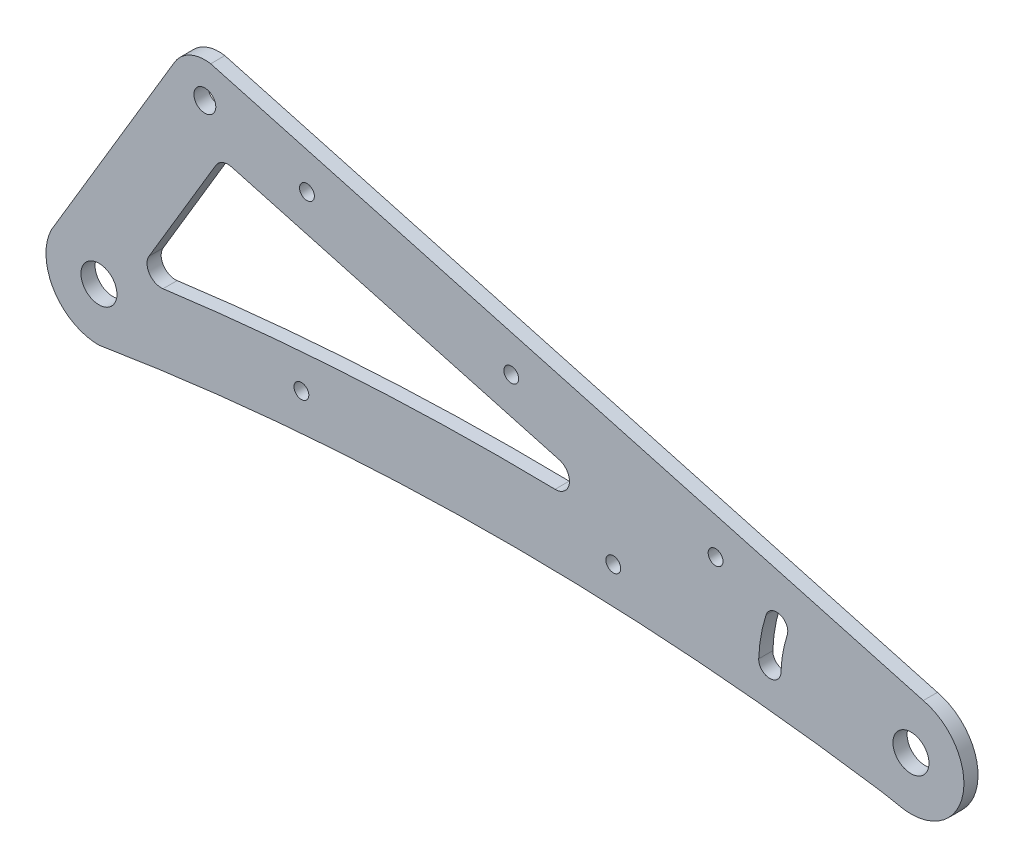
ISO-10303-21;
HEADER;
FILE_DESCRIPTION(('STEP AP214'),'2;1');
FILE_NAME('part.step','',(''),(''),'','','');
FILE_SCHEMA(('AUTOMOTIVE_DESIGN { 1 0 10303 214 1 1 1 1 }'));
ENDSEC;
DATA;
#1=APPLICATION_CONTEXT('core data for automotive mechanical design processes');
#2=APPLICATION_PROTOCOL_DEFINITION('international standard','automotive_design',2000,#1);
#3=PRODUCT_CONTEXT('',#1,'mechanical');
#4=PRODUCT('Part','Part','',(#3));
#5=PRODUCT_RELATED_PRODUCT_CATEGORY('part','',(#4));
#6=PRODUCT_DEFINITION_FORMATION('','',#4);
#7=PRODUCT_DEFINITION_CONTEXT('part definition',#1,'design');
#8=PRODUCT_DEFINITION('design','',#6,#7);
#9=PRODUCT_DEFINITION_SHAPE('','',#8);
#10=(LENGTH_UNIT() NAMED_UNIT(*) SI_UNIT(.MILLI.,.METRE.));
#11=(NAMED_UNIT(*) PLANE_ANGLE_UNIT() SI_UNIT($,.RADIAN.));
#12=(NAMED_UNIT(*) SI_UNIT($,.STERADIAN.) SOLID_ANGLE_UNIT());
#13=UNCERTAINTY_MEASURE_WITH_UNIT(LENGTH_MEASURE(1.E-05),#10,'distance_accuracy_value','');
#14=(GEOMETRIC_REPRESENTATION_CONTEXT(3) GLOBAL_UNCERTAINTY_ASSIGNED_CONTEXT((#13)) GLOBAL_UNIT_ASSIGNED_CONTEXT((#10,
#11,#12)) REPRESENTATION_CONTEXT('',''));
#15=CARTESIAN_POINT('',(0.,0.,0.));
#16=DIRECTION('',(0.,0.,1.));
#17=DIRECTION('',(1.,0.,0.));
#18=AXIS2_PLACEMENT_3D('',#15,#16,#17);
#19=CARTESIAN_POINT('',(204.633430014987,-118.311187667082,-4.));
#20=DIRECTION('',(0.,0.,1.));
#21=DIRECTION('',(1.,0.,0.));
#22=AXIS2_PLACEMENT_3D('',#19,#20,#21);
#23=CYLINDRICAL_SURFACE('',#22,106.);
#24=CARTESIAN_POINT('',(204.633430014987,-118.311187667082,0.));
#25=DIRECTION('',(0.,0.,-1.));
#26=DIRECTION('',(1.,0.,0.));
#27=AXIS2_PLACEMENT_3D('',#24,#25,#26);
#28=CIRCLE('',#27,106.);
#29=CARTESIAN_POINT('',(220.379871585658,-13.4872897341131,0.));
#30=VERTEX_POINT('',#29);
#31=CARTESIAN_POINT('',(226.855383886155,-14.6666761570763,0.));
#32=VERTEX_POINT('',#31);
#33=EDGE_CURVE('E292',#30,#32,#28,.T.);
#34=ORIENTED_EDGE('',*,*,#33,.F.);
#35=DIRECTION('',(0.,0.,1.));
#36=VECTOR('',#35,1.);
#37=CARTESIAN_POINT('',(220.379871585658,-13.4872897341131,-4.));
#38=LINE('',#37,#36);
#39=CARTESIAN_POINT('',(220.379871585658,-13.4872897341131,-4.));
#40=VERTEX_POINT('',#39);
#41=EDGE_CURVE('E11',#40,#30,#38,.T.);
#42=ORIENTED_EDGE('',*,*,#41,.F.);
#43=CARTESIAN_POINT('',(204.633430014987,-118.311187667082,-4.));
#44=DIRECTION('',(0.,0.,-1.));
#45=DIRECTION('',(1.,0.,0.));
#46=AXIS2_PLACEMENT_3D('',#43,#44,#45);
#47=CIRCLE('',#46,106.);
#48=CARTESIAN_POINT('',(226.855383886155,-14.6666761570763,-4.));
#49=VERTEX_POINT('',#48);
#50=EDGE_CURVE('E295',#40,#49,#47,.T.);
#51=ORIENTED_EDGE('',*,*,#50,.T.);
#52=DIRECTION('',(0.,0.,1.));
#53=VECTOR('',#52,1.);
#54=CARTESIAN_POINT('',(226.855383886155,-14.6666761570763,-4.));
#55=LINE('',#54,#53);
#56=EDGE_CURVE('E45',#49,#32,#55,.T.);
#57=ORIENTED_EDGE('',*,*,#56,.T.);
#58=EDGE_LOOP('',(#34,#42,#51,#57));
#59=FACE_BOUND('',#58,.T.);
#60=ADVANCED_FACE('F42',(#59),#23,.F.);
#61=CARTESIAN_POINT('',(115.,-715.,-4.));
#62=DIRECTION('',(0.,0.,1.));
#63=DIRECTION('',(1.,0.,0.));
#64=AXIS2_PLACEMENT_3D('',#61,#62,#63);
#65=CYLINDRICAL_SURFACE('',#64,709.383535190943);
#66=CARTESIAN_POINT('',(115.,-715.,0.));
#67=DIRECTION('',(0.,0.,-1.));
#68=DIRECTION('',(-1.,0.,0.));
#69=AXIS2_PLACEMENT_3D('',#66,#67,#68);
#70=CIRCLE('',#69,709.383535190943);
#71=CARTESIAN_POINT('',(0.,-15.,0.));
#72=VERTEX_POINT('',#71);
#73=EDGE_CURVE('E299',#72,#30,#70,.T.);
#74=ORIENTED_EDGE('',*,*,#73,.F.);
#75=DIRECTION('',(0.,0.,1.));
#76=VECTOR('',#75,1.);
#77=CARTESIAN_POINT('',(0.,-15.,-4.));
#78=LINE('',#77,#76);
#79=CARTESIAN_POINT('',(0.,-15.,-4.));
#80=VERTEX_POINT('',#79);
#81=EDGE_CURVE('E50',#80,#72,#78,.T.);
#82=ORIENTED_EDGE('',*,*,#81,.F.);
#83=CARTESIAN_POINT('',(115.,-715.,-4.));
#84=DIRECTION('',(0.,0.,-1.));
#85=DIRECTION('',(-1.,0.,0.));
#86=AXIS2_PLACEMENT_3D('',#83,#84,#85);
#87=CIRCLE('',#86,709.383535190943);
#88=EDGE_CURVE('E313',#80,#40,#87,.T.);
#89=ORIENTED_EDGE('',*,*,#88,.T.);
#90=ORIENTED_EDGE('',*,*,#41,.T.);
#91=EDGE_LOOP('',(#74,#82,#89,#90));
#92=FACE_BOUND('',#91,.T.);
#93=ADVANCED_FACE('F354',(#92),#65,.F.);
#94=CARTESIAN_POINT('',(0.,0.,-4.));
#95=DIRECTION('',(0.,0.,1.));
#96=DIRECTION('',(1.,0.,0.));
#97=AXIS2_PLACEMENT_3D('',#94,#95,#96);
#98=CYLINDRICAL_SURFACE('',#97,15.);
#99=CARTESIAN_POINT('',(0.,0.,0.));
#100=DIRECTION('',(0.,0.,1.));
#101=DIRECTION('',(1.,0.,0.));
#102=AXIS2_PLACEMENT_3D('',#99,#100,#101);
#103=CIRCLE('',#102,15.);
#104=CARTESIAN_POINT('',(-13.4841015537428,6.57107337414145,0.));
#105=VERTEX_POINT('',#104);
#106=EDGE_CURVE('E330',#105,#72,#103,.T.);
#107=ORIENTED_EDGE('',*,*,#106,.F.);
#108=DIRECTION('',(0.,0.,1.));
#109=VECTOR('',#108,1.);
#110=CARTESIAN_POINT('',(-13.4841015537428,6.57107337414145,-4.));
#111=LINE('',#110,#109);
#112=CARTESIAN_POINT('',(-13.4841015537428,6.57107337414145,-4.));
#113=VERTEX_POINT('',#112);
#114=EDGE_CURVE('E336',#113,#105,#111,.T.);
#115=ORIENTED_EDGE('',*,*,#114,.F.);
#116=CARTESIAN_POINT('',(0.,0.,-4.));
#117=DIRECTION('',(0.,0.,1.));
#118=DIRECTION('',(1.,0.,0.));
#119=AXIS2_PLACEMENT_3D('',#116,#117,#118);
#120=CIRCLE('',#119,15.);
#121=EDGE_CURVE('E310',#113,#80,#120,.T.);
#122=ORIENTED_EDGE('',*,*,#121,.T.);
#123=ORIENTED_EDGE('',*,*,#81,.T.);
#124=EDGE_LOOP('',(#107,#115,#122,#123));
#125=FACE_BOUND('',#124,.T.);
#126=ADVANCED_FACE('F372',(#125),#98,.T.);
#127=CARTESIAN_POINT('',(21.4162561466277,65.1302379535158,-4.));
#128=DIRECTION('',(-0.859010929428939,0.511957247357268,0.));
#129=DIRECTION('',(-0.511957247357268,-0.859010929428939,0.));
#130=AXIS2_PLACEMENT_3D('',#127,#128,#129);
#131=PLANE('',#130);
#132=DIRECTION('',(-0.511957247357268,-0.859010929428939,0.));
#133=VECTOR('',#132,1.);
#134=CARTESIAN_POINT('',(21.4162561466277,65.1302379535158,0.));
#135=LINE('',#134,#133);
#136=CARTESIAN_POINT('',(21.4162561466277,65.1302379535158,0.));
#137=VERTEX_POINT('',#136);
#138=EDGE_CURVE('E327',#137,#105,#135,.T.);
#139=ORIENTED_EDGE('',*,*,#138,.F.);
#140=DIRECTION('',(0.,0.,1.));
#141=VECTOR('',#140,1.);
#142=CARTESIAN_POINT('',(21.4162561466277,65.1302379535158,-4.));
#143=LINE('',#142,#141);
#144=CARTESIAN_POINT('',(21.4162561466277,65.1302379535158,-4.));
#145=VERTEX_POINT('',#144);
#146=EDGE_CURVE('E338',#145,#137,#143,.T.);
#147=ORIENTED_EDGE('',*,*,#146,.F.);
#148=DIRECTION('',(-0.511957247357268,-0.859010929428939,0.));
#149=VECTOR('',#148,1.);
#150=CARTESIAN_POINT('',(21.4162561466277,65.1302379535158,-4.));
#151=LINE('',#150,#149);
#152=EDGE_CURVE('E307',#145,#113,#151,.T.);
#153=ORIENTED_EDGE('',*,*,#152,.T.);
#154=ORIENTED_EDGE('',*,*,#114,.T.);
#155=EDGE_LOOP('',(#139,#147,#153,#154));
#156=FACE_BOUND('',#155,.T.);
#157=ADVANCED_FACE('F370',(#156),#131,.T.);
#158=CARTESIAN_POINT('',(30.,60.,-4.));
#159=DIRECTION('',(0.,0.,1.));
#160=DIRECTION('',(1.,0.,0.));
#161=AXIS2_PLACEMENT_3D('',#158,#159,#160);
#162=CYLINDRICAL_SURFACE('',#161,10.);
#163=CARTESIAN_POINT('',(30.,60.,0.));
#164=DIRECTION('',(0.,0.,1.));
#165=DIRECTION('',(1.,0.,0.));
#166=AXIS2_PLACEMENT_3D('',#163,#164,#165);
#167=CIRCLE('',#166,10.);
#168=CARTESIAN_POINT('',(31.6565828742478,69.8618321411769,0.));
#169=VERTEX_POINT('',#168);
#170=EDGE_CURVE('E324',#169,#137,#167,.T.);
#171=ORIENTED_EDGE('',*,*,#170,.F.);
#172=DIRECTION('',(0.,0.,1.));
#173=VECTOR('',#172,1.);
#174=CARTESIAN_POINT('',(31.6565828742478,69.8618321411769,-4.));
#175=LINE('',#174,#173);
#176=CARTESIAN_POINT('',(31.6565828742478,69.8618321411769,-4.));
#177=VERTEX_POINT('',#176);
#178=EDGE_CURVE('E340',#177,#169,#175,.T.);
#179=ORIENTED_EDGE('',*,*,#178,.F.);
#180=CARTESIAN_POINT('',(30.,60.,-4.));
#181=DIRECTION('',(0.,0.,1.));
#182=DIRECTION('',(1.,0.,0.));
#183=AXIS2_PLACEMENT_3D('',#180,#181,#182);
#184=CIRCLE('',#183,10.);
#185=EDGE_CURVE('E304',#177,#145,#184,.T.);
#186=ORIENTED_EDGE('',*,*,#185,.T.);
#187=ORIENTED_EDGE('',*,*,#146,.T.);
#188=EDGE_LOOP('',(#171,#179,#186,#187));
#189=FACE_BOUND('',#188,.T.);
#190=ADVANCED_FACE('F367',(#189),#162,.T.);
#191=CARTESIAN_POINT('',(31.6565828742478,69.8618321411769,-4.));
#192=DIRECTION('',(0.26413012047126,0.964487055102264,0.));
#193=DIRECTION('',(-0.964487055102264,0.26413012047126,0.));
#194=AXIS2_PLACEMENT_3D('',#191,#192,#193);
#195=PLANE('',#194);
#196=DIRECTION('',(-0.964487055102264,0.26413012047126,0.));
#197=VECTOR('',#196,1.);
#198=CARTESIAN_POINT('',(31.6565828742478,69.8618321411769,0.));
#199=LINE('',#198,#197);
#200=CARTESIAN_POINT('',(233.498309610251,14.5863576629269,0.));
#201=VERTEX_POINT('',#200);
#202=EDGE_CURVE('E321',#201,#169,#199,.T.);
#203=ORIENTED_EDGE('',*,*,#202,.F.);
#204=DIRECTION('',(0.,0.,1.));
#205=VECTOR('',#204,1.);
#206=CARTESIAN_POINT('',(233.498309610251,14.5863576629269,-4.));
#207=LINE('',#206,#205);
#208=CARTESIAN_POINT('',(233.498309610251,14.5863576629269,-4.));
#209=VERTEX_POINT('',#208);
#210=EDGE_CURVE('E341',#209,#201,#207,.T.);
#211=ORIENTED_EDGE('',*,*,#210,.F.);
#212=DIRECTION('',(-0.964487055102264,0.26413012047126,0.));
#213=VECTOR('',#212,1.);
#214=CARTESIAN_POINT('',(31.6565828742478,69.8618321411769,-4.));
#215=LINE('',#214,#213);
#216=EDGE_CURVE('E301',#209,#177,#215,.T.);
#217=ORIENTED_EDGE('',*,*,#216,.T.);
#218=ORIENTED_EDGE('',*,*,#178,.T.);
#219=EDGE_LOOP('',(#203,#211,#217,#218));
#220=FACE_BOUND('',#219,.T.);
#221=ADVANCED_FACE('F363',(#220),#195,.T.);
#222=CARTESIAN_POINT('',(230.,0.,-4.));
#223=DIRECTION('',(0.,0.,1.));
#224=DIRECTION('',(1.,0.,0.));
#225=AXIS2_PLACEMENT_3D('',#222,#223,#224);
#226=CYLINDRICAL_SURFACE('',#225,15.);
#227=CARTESIAN_POINT('',(230.,0.,0.));
#228=DIRECTION('',(0.,0.,1.));
#229=DIRECTION('',(1.,0.,0.));
#230=AXIS2_PLACEMENT_3D('',#227,#228,#229);
#231=CIRCLE('',#230,15.);
#232=EDGE_CURVE('E318',#32,#201,#231,.T.);
#233=ORIENTED_EDGE('',*,*,#232,.F.);
#234=ORIENTED_EDGE('',*,*,#56,.F.);
#235=CARTESIAN_POINT('',(230.,0.,-4.));
#236=DIRECTION('',(0.,0.,1.));
#237=DIRECTION('',(-1.,0.,0.));
#238=AXIS2_PLACEMENT_3D('',#235,#236,#237);
#239=CIRCLE('',#238,15.);
#240=EDGE_CURVE('E298',#49,#209,#239,.T.);
#241=ORIENTED_EDGE('',*,*,#240,.T.);
#242=ORIENTED_EDGE('',*,*,#210,.T.);
#243=EDGE_LOOP('',(#233,#234,#241,#242));
#244=FACE_BOUND('',#243,.T.);
#245=ADVANCED_FACE('F361',(#244),#226,.T.);
#246=CARTESIAN_POINT('',(204.633430014987,-118.311187667082,-4.));
#247=DIRECTION('',(0.,0.,1.));
#248=DIRECTION('',(1.,0.,0.));
#249=AXIS2_PLACEMENT_3D('',#246,#247,#248);
#250=PLANE('',#249);
#251=CARTESIAN_POINT('',(190.024366919236,1.39597986809987,-4.));
#252=DIRECTION('',(0.,0.,1.));
#253=DIRECTION('',(1.,0.,0.));
#254=AXIS2_PLACEMENT_3D('',#251,#252,#253);
#255=CIRCLE('',#254,3.15);
#256=CARTESIAN_POINT('',(186.876285814126,1.50591328271273,-4.));
#257=VERTEX_POINT('',#256);
#258=CARTESIAN_POINT('',(193.172448024346,1.286046453487,-4.));
#259=VERTEX_POINT('',#258);
#260=EDGE_CURVE('E192',#257,#259,#255,.T.);
#261=ORIENTED_EDGE('',*,*,#260,.T.);
#262=CARTESIAN_POINT('',(230.,0.,-4.));
#263=DIRECTION('',(0.,0.,1.));
#264=DIRECTION('',(1.,0.,0.));
#265=AXIS2_PLACEMENT_3D('',#262,#263,#264);
#266=CIRCLE('',#265,36.85);
#267=CARTESIAN_POINT('',(194.953567374524,11.387276242717,-4.));
#268=VERTEX_POINT('',#267);
#269=EDGE_CURVE('E195',#259,#268,#266,.F.);
#270=ORIENTED_EDGE('',*,*,#269,.T.);
#271=CARTESIAN_POINT('',(191.957739348194,12.3606797749981,-4.));
#272=DIRECTION('',(0.,0.,1.));
#273=DIRECTION('',(1.,0.,0.));
#274=AXIS2_PLACEMENT_3D('',#271,#272,#273);
#275=CIRCLE('',#274,3.14999999999999);
#276=CARTESIAN_POINT('',(188.961911321864,13.3340833072791,-4.));
#277=VERTEX_POINT('',#276);
#278=EDGE_CURVE('E187',#268,#277,#275,.T.);
#279=ORIENTED_EDGE('',*,*,#278,.T.);
#280=CARTESIAN_POINT('',(230.,0.,-4.));
#281=DIRECTION('',(0.,0.,1.));
#282=DIRECTION('',(1.,0.,0.));
#283=AXIS2_PLACEMENT_3D('',#280,#281,#282);
#284=CIRCLE('',#283,43.15);
#285=EDGE_CURVE('E167',#277,#257,#284,.T.);
#286=ORIENTED_EDGE('',*,*,#285,.T.);
#287=EDGE_LOOP('',(#261,#270,#279,#286));
#288=FACE_BOUND('',#287,.T.);
#289=CARTESIAN_POINT('',(58.9211424929098,52.0270760128541,-4.));
#290=DIRECTION('',(0.,0.,1.));
#291=DIRECTION('',(1.,0.,0.));
#292=AXIS2_PLACEMENT_3D('',#289,#290,#291);
#293=CIRCLE('',#292,2.09999999999999);
#294=CARTESIAN_POINT('',(61.0211424929098,52.0270760128541,-4.));
#295=VERTEX_POINT('',#294);
#296=EDGE_CURVE('E225',#295,#295,#293,.T.);
#297=ORIENTED_EDGE('',*,*,#296,.T.);
#298=EDGE_LOOP('',(#297));
#299=FACE_BOUND('',#298,.T.);
#300=CARTESIAN_POINT('',(116.790365799046,36.1792687845785,-4.));
#301=DIRECTION('',(0.,0.,1.));
#302=DIRECTION('',(1.,0.,0.));
#303=AXIS2_PLACEMENT_3D('',#300,#301,#302);
#304=CIRCLE('',#303,2.09999999999999);
#305=CARTESIAN_POINT('',(118.890365799046,36.1792687845785,-4.));
#306=VERTEX_POINT('',#305);
#307=EDGE_CURVE('E222',#306,#306,#304,.T.);
#308=ORIENTED_EDGE('',*,*,#307,.T.);
#309=EDGE_LOOP('',(#308));
#310=FACE_BOUND('',#309,.T.);
#311=CARTESIAN_POINT('',(145.694686329833,4.1011676287479,-4.));
#312=DIRECTION('',(0.,0.,1.));
#313=DIRECTION('',(1.,0.,0.));
#314=AXIS2_PLACEMENT_3D('',#311,#312,#313);
#315=CIRCLE('',#314,2.09999999999999);
#316=CARTESIAN_POINT('',(147.794686329833,4.1011676287479,-4.));
#317=VERTEX_POINT('',#316);
#318=EDGE_CURVE('E219',#317,#317,#315,.T.);
#319=ORIENTED_EDGE('',*,*,#318,.T.);
#320=EDGE_LOOP('',(#319));
#321=FACE_BOUND('',#320,.T.);
#322=CARTESIAN_POINT('',(174.659589105182,20.3314615563029,-4.));
#323=DIRECTION('',(0.,0.,1.));
#324=DIRECTION('',(1.,0.,0.));
#325=AXIS2_PLACEMENT_3D('',#322,#323,#324);
#326=CIRCLE('',#325,2.09999999999999);
#327=CARTESIAN_POINT('',(176.759589105182,20.3314615563029,-4.));
#328=VERTEX_POINT('',#327);
#329=EDGE_CURVE('E216',#328,#328,#326,.T.);
#330=ORIENTED_EDGE('',*,*,#329,.T.);
#331=EDGE_LOOP('',(#330));
#332=FACE_BOUND('',#331,.T.);
#333=CARTESIAN_POINT('',(57.3419719734467,2.44282340685842,-4.));
#334=DIRECTION('',(0.,0.,1.));
#335=DIRECTION('',(1.,0.,0.));
#336=AXIS2_PLACEMENT_3D('',#333,#334,#335);
#337=CIRCLE('',#336,2.09999999999999);
#338=CARTESIAN_POINT('',(59.4419719734467,2.44282340685842,-4.));
#339=VERTEX_POINT('',#338);
#340=EDGE_CURVE('E213',#339,#339,#337,.T.);
#341=ORIENTED_EDGE('',*,*,#340,.T.);
#342=EDGE_LOOP('',(#341));
#343=FACE_BOUND('',#342,.T.);
#344=CARTESIAN_POINT('',(115.,-715.,-4.));
#345=DIRECTION('',(0.,0.,-1.));
#346=DIRECTION('',(-1.,0.,0.));
#347=AXIS2_PLACEMENT_3D('',#344,#345,#346);
#348=CIRCLE('',#347,729.383535190943);
#349=CARTESIAN_POINT('',(18.156304086855,7.9257499698846,-4.));
#350=VERTEX_POINT('',#349);
#351=CARTESIAN_POINT('',(129.197928500749,14.2453361070782,-4.));
#352=VERTEX_POINT('',#351);
#353=EDGE_CURVE('E245',#350,#352,#348,.T.);
#354=ORIENTED_EDGE('',*,*,#353,.T.);
#355=CARTESIAN_POINT('',(129.275791122077,18.2445782118024,-4.));
#356=DIRECTION('',(0.,0.,1.));
#357=DIRECTION('',(1.,0.,0.));
#358=AXIS2_PLACEMENT_3D('',#355,#356,#357);
#359=CIRCLE('',#358,4.00000000000003);
#360=CARTESIAN_POINT('',(130.332311603962,22.1025264322115,-4.));
#361=VERTEX_POINT('',#360);
#362=EDGE_CURVE('E229',#352,#361,#359,.T.);
#363=ORIENTED_EDGE('',*,*,#362,.T.);
#364=DIRECTION('',(-0.964487055102264,0.26413012047126,0.));
#365=VECTOR('',#364,1.);
#366=CARTESIAN_POINT('',(37.6033850218357,47.4968564232041,-4.));
#367=LINE('',#366,#365);
#368=CARTESIAN_POINT('',(37.6033850218357,47.4968564232041,-4.));
#369=VERTEX_POINT('',#368);
#370=EDGE_CURVE('E232',#361,#369,#367,.T.);
#371=ORIENTED_EDGE('',*,*,#370,.T.);
#372=CARTESIAN_POINT('',(36.5468645399507,43.6389082027951,-4.));
#373=DIRECTION('',(0.,0.,1.));
#374=DIRECTION('',(1.,0.,0.));
#375=AXIS2_PLACEMENT_3D('',#372,#373,#374);
#376=CIRCLE('',#375,4.);
#377=CARTESIAN_POINT('',(33.1108208222349,45.6867371922241,-4.));
#378=VERTEX_POINT('',#377);
#379=EDGE_CURVE('E236',#369,#378,#376,.T.);
#380=ORIENTED_EDGE('',*,*,#379,.T.);
#381=DIRECTION('',(-0.511957247357268,-0.859010929428939,0.));
#382=VECTOR('',#381,1.);
#383=CARTESIAN_POINT('',(33.1108208222349,45.6867371922241,-4.));
#384=LINE('',#383,#382);
#385=CARTESIAN_POINT('',(14.1891614822538,13.9381639277999,-4.));
#386=VERTEX_POINT('',#385);
#387=EDGE_CURVE('E239',#378,#386,#384,.T.);
#388=ORIENTED_EDGE('',*,*,#387,.T.);
#389=CARTESIAN_POINT('',(17.6252051999695,11.8903349383709,-4.));
#390=DIRECTION('',(0.,0.,1.));
#391=DIRECTION('',(-1.,0.,0.));
#392=AXIS2_PLACEMENT_3D('',#389,#390,#391);
#393=CIRCLE('',#392,3.99999999999993);
#394=EDGE_CURVE('E242',#386,#350,#393,.T.);
#395=ORIENTED_EDGE('',*,*,#394,.T.);
#396=EDGE_LOOP('',(#354,#363,#371,#380,#388,#395));
#397=FACE_BOUND('',#396,.T.);
#398=CARTESIAN_POINT('',(30.,60.,-4.));
#399=DIRECTION('',(0.,0.,1.));
#400=DIRECTION('',(1.,0.,0.));
#401=AXIS2_PLACEMENT_3D('',#398,#399,#400);
#402=CIRCLE('',#401,3.09999999999999);
#403=CARTESIAN_POINT('',(33.1,60.,-4.));
#404=VERTEX_POINT('',#403);
#405=EDGE_CURVE('E277',#404,#404,#402,.T.);
#406=ORIENTED_EDGE('',*,*,#405,.T.);
#407=EDGE_LOOP('',(#406));
#408=FACE_BOUND('',#407,.T.);
#409=CARTESIAN_POINT('',(0.,0.,-4.));
#410=DIRECTION('',(0.,0.,1.));
#411=DIRECTION('',(1.,0.,0.));
#412=AXIS2_PLACEMENT_3D('',#409,#410,#411);
#413=CIRCLE('',#412,5.1);
#414=CARTESIAN_POINT('',(5.1,0.,-4.));
#415=VERTEX_POINT('',#414);
#416=EDGE_CURVE('E283',#415,#415,#413,.T.);
#417=ORIENTED_EDGE('',*,*,#416,.T.);
#418=EDGE_LOOP('',(#417));
#419=FACE_BOUND('',#418,.T.);
#420=CARTESIAN_POINT('',(230.,0.,-4.));
#421=DIRECTION('',(0.,0.,1.));
#422=DIRECTION('',(1.,0.,0.));
#423=AXIS2_PLACEMENT_3D('',#420,#421,#422);
#424=CIRCLE('',#423,5.09999999999998);
#425=CARTESIAN_POINT('',(235.1,0.,-4.));
#426=VERTEX_POINT('',#425);
#427=EDGE_CURVE('E289',#426,#426,#424,.T.);
#428=ORIENTED_EDGE('',*,*,#427,.T.);
#429=EDGE_LOOP('',(#428));
#430=FACE_BOUND('',#429,.T.);
#431=ORIENTED_EDGE('',*,*,#50,.F.);
#432=ORIENTED_EDGE('',*,*,#88,.F.);
#433=ORIENTED_EDGE('',*,*,#121,.F.);
#434=ORIENTED_EDGE('',*,*,#152,.F.);
#435=ORIENTED_EDGE('',*,*,#185,.F.);
#436=ORIENTED_EDGE('',*,*,#216,.F.);
#437=ORIENTED_EDGE('',*,*,#240,.F.);
#438=EDGE_LOOP('',(#431,#432,#433,#434,#435,#436,#437));
#439=FACE_BOUND('',#438,.T.);
#440=ADVANCED_FACE('F357',(#288,#299,#310,#321,#332,#343,#397,#408,#419,#430,#439),#250,.F.);
#441=CARTESIAN_POINT('',(204.633430014987,-118.311187667082,0.));
#442=DIRECTION('',(0.,0.,1.));
#443=DIRECTION('',(1.,0.,0.));
#444=AXIS2_PLACEMENT_3D('',#441,#442,#443);
#445=PLANE('',#444);
#446=CARTESIAN_POINT('',(230.,0.,0.));
#447=DIRECTION('',(0.,0.,-1.));
#448=DIRECTION('',(-1.,0.,0.));
#449=AXIS2_PLACEMENT_3D('',#446,#447,#448);
#450=CIRCLE('',#449,36.85);
#451=CARTESIAN_POINT('',(193.172448024346,1.286046453487,0.));
#452=VERTEX_POINT('',#451);
#453=CARTESIAN_POINT('',(194.953567374524,11.387276242717,0.));
#454=VERTEX_POINT('',#453);
#455=EDGE_CURVE('E66',#452,#454,#450,.T.);
#456=ORIENTED_EDGE('',*,*,#455,.F.);
#457=CARTESIAN_POINT('',(190.024366919236,1.39597986809987,0.));
#458=DIRECTION('',(0.,0.,1.));
#459=DIRECTION('',(1.,0.,0.));
#460=AXIS2_PLACEMENT_3D('',#457,#458,#459);
#461=CIRCLE('',#460,3.15);
#462=CARTESIAN_POINT('',(186.876285814126,1.50591328271273,0.));
#463=VERTEX_POINT('',#462);
#464=EDGE_CURVE('E180',#463,#452,#461,.T.);
#465=ORIENTED_EDGE('',*,*,#464,.F.);
#466=CARTESIAN_POINT('',(230.,0.,0.));
#467=DIRECTION('',(0.,0.,1.));
#468=DIRECTION('',(-1.,0.,0.));
#469=AXIS2_PLACEMENT_3D('',#466,#467,#468);
#470=CIRCLE('',#469,43.15);
#471=CARTESIAN_POINT('',(188.961911321864,13.3340833072791,0.));
#472=VERTEX_POINT('',#471);
#473=EDGE_CURVE('E164',#472,#463,#470,.T.);
#474=ORIENTED_EDGE('',*,*,#473,.F.);
#475=CARTESIAN_POINT('',(191.957739348194,12.3606797749981,0.));
#476=DIRECTION('',(0.,0.,1.));
#477=DIRECTION('',(1.,0.,0.));
#478=AXIS2_PLACEMENT_3D('',#475,#476,#477);
#479=CIRCLE('',#478,3.14999999999999);
#480=EDGE_CURVE('E173',#454,#472,#479,.T.);
#481=ORIENTED_EDGE('',*,*,#480,.F.);
#482=EDGE_LOOP('',(#456,#465,#474,#481));
#483=FACE_BOUND('',#482,.T.);
#484=CARTESIAN_POINT('',(58.9211424929098,52.0270760128541,0.));
#485=DIRECTION('',(0.,0.,1.));
#486=DIRECTION('',(1.,0.,0.));
#487=AXIS2_PLACEMENT_3D('',#484,#485,#486);
#488=CIRCLE('',#487,2.09999999999999);
#489=CARTESIAN_POINT('',(61.0211424929098,52.0270760128541,0.));
#490=VERTEX_POINT('',#489);
#491=EDGE_CURVE('E198',#490,#490,#488,.T.);
#492=ORIENTED_EDGE('',*,*,#491,.F.);
#493=EDGE_LOOP('',(#492));
#494=FACE_BOUND('',#493,.T.);
#495=CARTESIAN_POINT('',(116.790365799046,36.1792687845785,0.));
#496=DIRECTION('',(0.,0.,1.));
#497=DIRECTION('',(1.,0.,0.));
#498=AXIS2_PLACEMENT_3D('',#495,#496,#497);
#499=CIRCLE('',#498,2.09999999999999);
#500=CARTESIAN_POINT('',(118.890365799046,36.1792687845785,0.));
#501=VERTEX_POINT('',#500);
#502=EDGE_CURVE('E206',#501,#501,#499,.T.);
#503=ORIENTED_EDGE('',*,*,#502,.F.);
#504=EDGE_LOOP('',(#503));
#505=FACE_BOUND('',#504,.T.);
#506=CARTESIAN_POINT('',(145.694686329833,4.1011676287479,0.));
#507=DIRECTION('',(0.,0.,1.));
#508=DIRECTION('',(1.,0.,0.));
#509=AXIS2_PLACEMENT_3D('',#506,#507,#508);
#510=CIRCLE('',#509,2.09999999999999);
#511=CARTESIAN_POINT('',(147.794686329833,4.1011676287479,0.));
#512=VERTEX_POINT('',#511);
#513=EDGE_CURVE('E203',#512,#512,#510,.T.);
#514=ORIENTED_EDGE('',*,*,#513,.F.);
#515=EDGE_LOOP('',(#514));
#516=FACE_BOUND('',#515,.T.);
#517=CARTESIAN_POINT('',(174.659589105182,20.3314615563029,0.));
#518=DIRECTION('',(0.,0.,1.));
#519=DIRECTION('',(1.,0.,0.));
#520=AXIS2_PLACEMENT_3D('',#517,#518,#519);
#521=CIRCLE('',#520,2.09999999999999);
#522=CARTESIAN_POINT('',(176.759589105182,20.3314615563029,0.));
#523=VERTEX_POINT('',#522);
#524=EDGE_CURVE('E199',#523,#523,#521,.T.);
#525=ORIENTED_EDGE('',*,*,#524,.F.);
#526=EDGE_LOOP('',(#525));
#527=FACE_BOUND('',#526,.T.);
#528=CARTESIAN_POINT('',(57.3419719734467,2.44282340685842,0.));
#529=DIRECTION('',(0.,0.,1.));
#530=DIRECTION('',(1.,0.,0.));
#531=AXIS2_PLACEMENT_3D('',#528,#529,#530);
#532=CIRCLE('',#531,2.09999999999999);
#533=CARTESIAN_POINT('',(59.4419719734467,2.44282340685842,0.));
#534=VERTEX_POINT('',#533);
#535=EDGE_CURVE('E202',#534,#534,#532,.T.);
#536=ORIENTED_EDGE('',*,*,#535,.F.);
#537=EDGE_LOOP('',(#536));
#538=FACE_BOUND('',#537,.T.);
#539=CARTESIAN_POINT('',(129.275791122077,18.2445782118024,0.));
#540=DIRECTION('',(0.,0.,1.));
#541=DIRECTION('',(1.,0.,0.));
#542=AXIS2_PLACEMENT_3D('',#539,#540,#541);
#543=CIRCLE('',#542,4.00000000000003);
#544=CARTESIAN_POINT('',(129.197928500749,14.2453361070782,0.));
#545=VERTEX_POINT('',#544);
#546=CARTESIAN_POINT('',(130.332311603962,22.1025264322115,0.));
#547=VERTEX_POINT('',#546);
#548=EDGE_CURVE('E228',#545,#547,#543,.T.);
#549=ORIENTED_EDGE('',*,*,#548,.F.);
#550=CARTESIAN_POINT('',(115.,-715.,0.));
#551=DIRECTION('',(0.,0.,-1.));
#552=DIRECTION('',(-1.,0.,0.));
#553=AXIS2_PLACEMENT_3D('',#550,#551,#552);
#554=CIRCLE('',#553,729.383535190943);
#555=CARTESIAN_POINT('',(18.156304086855,7.9257499698846,0.));
#556=VERTEX_POINT('',#555);
#557=EDGE_CURVE('E233',#556,#545,#554,.T.);
#558=ORIENTED_EDGE('',*,*,#557,.F.);
#559=CARTESIAN_POINT('',(17.6252051999695,11.8903349383709,0.));
#560=DIRECTION('',(0.,0.,1.));
#561=DIRECTION('',(-1.,0.,0.));
#562=AXIS2_PLACEMENT_3D('',#559,#560,#561);
#563=CIRCLE('',#562,3.99999999999993);
#564=CARTESIAN_POINT('',(14.1891614822538,13.9381639277999,0.));
#565=VERTEX_POINT('',#564);
#566=EDGE_CURVE('E259',#565,#556,#563,.T.);
#567=ORIENTED_EDGE('',*,*,#566,.F.);
#568=DIRECTION('',(-0.511957247357268,-0.859010929428939,0.));
#569=VECTOR('',#568,1.);
#570=CARTESIAN_POINT('',(33.1108208222349,45.6867371922241,0.));
#571=LINE('',#570,#569);
#572=CARTESIAN_POINT('',(33.1108208222349,45.6867371922241,0.));
#573=VERTEX_POINT('',#572);
#574=EDGE_CURVE('E256',#573,#565,#571,.T.);
#575=ORIENTED_EDGE('',*,*,#574,.F.);
#576=CARTESIAN_POINT('',(36.5468645399507,43.6389082027951,0.));
#577=DIRECTION('',(0.,0.,1.));
#578=DIRECTION('',(1.,0.,0.));
#579=AXIS2_PLACEMENT_3D('',#576,#577,#578);
#580=CIRCLE('',#579,4.);
#581=CARTESIAN_POINT('',(37.6033850218357,47.4968564232041,0.));
#582=VERTEX_POINT('',#581);
#583=EDGE_CURVE('E253',#582,#573,#580,.T.);
#584=ORIENTED_EDGE('',*,*,#583,.F.);
#585=DIRECTION('',(-0.964487055102264,0.26413012047126,0.));
#586=VECTOR('',#585,1.);
#587=CARTESIAN_POINT('',(37.6033850218357,47.4968564232041,0.));
#588=LINE('',#587,#586);
#589=EDGE_CURVE('E250',#547,#582,#588,.T.);
#590=ORIENTED_EDGE('',*,*,#589,.F.);
#591=EDGE_LOOP('',(#549,#558,#567,#575,#584,#590));
#592=FACE_BOUND('',#591,.T.);
#593=CARTESIAN_POINT('',(30.,60.,0.));
#594=DIRECTION('',(0.,0.,1.));
#595=DIRECTION('',(1.,0.,0.));
#596=AXIS2_PLACEMENT_3D('',#593,#594,#595);
#597=CIRCLE('',#596,3.09999999999999);
#598=CARTESIAN_POINT('',(33.1,60.,0.));
#599=VERTEX_POINT('',#598);
#600=EDGE_CURVE('E266',#599,#599,#597,.T.);
#601=ORIENTED_EDGE('',*,*,#600,.F.);
#602=EDGE_LOOP('',(#601));
#603=FACE_BOUND('',#602,.T.);
#604=CARTESIAN_POINT('',(0.,0.,0.));
#605=DIRECTION('',(0.,0.,1.));
#606=DIRECTION('',(1.,0.,0.));
#607=AXIS2_PLACEMENT_3D('',#604,#605,#606);
#608=CIRCLE('',#607,5.1);
#609=CARTESIAN_POINT('',(5.1,0.,0.));
#610=VERTEX_POINT('',#609);
#611=EDGE_CURVE('E280',#610,#610,#608,.T.);
#612=ORIENTED_EDGE('',*,*,#611,.F.);
#613=EDGE_LOOP('',(#612));
#614=FACE_BOUND('',#613,.T.);
#615=CARTESIAN_POINT('',(230.,0.,0.));
#616=DIRECTION('',(0.,0.,1.));
#617=DIRECTION('',(1.,0.,0.));
#618=AXIS2_PLACEMENT_3D('',#615,#616,#617);
#619=CIRCLE('',#618,5.09999999999998);
#620=CARTESIAN_POINT('',(235.1,0.,0.));
#621=VERTEX_POINT('',#620);
#622=EDGE_CURVE('E286',#621,#621,#619,.T.);
#623=ORIENTED_EDGE('',*,*,#622,.F.);
#624=EDGE_LOOP('',(#623));
#625=FACE_BOUND('',#624,.T.);
#626=ORIENTED_EDGE('',*,*,#33,.T.);
#627=ORIENTED_EDGE('',*,*,#232,.T.);
#628=ORIENTED_EDGE('',*,*,#202,.T.);
#629=ORIENTED_EDGE('',*,*,#170,.T.);
#630=ORIENTED_EDGE('',*,*,#138,.T.);
#631=ORIENTED_EDGE('',*,*,#106,.T.);
#632=ORIENTED_EDGE('',*,*,#73,.T.);
#633=EDGE_LOOP('',(#626,#627,#628,#629,#630,#631,#632));
#634=FACE_BOUND('',#633,.T.);
#635=ADVANCED_FACE('F177',(#483,#494,#505,#516,#527,#538,#592,#603,#614,#625,#634),#445,.T.);
#636=CARTESIAN_POINT('',(230.,0.,-4.));
#637=DIRECTION('',(0.,0.,1.));
#638=DIRECTION('',(1.,0.,0.));
#639=AXIS2_PLACEMENT_3D('',#636,#637,#638);
#640=CYLINDRICAL_SURFACE('',#639,5.09999999999998);
#641=ORIENTED_EDGE('',*,*,#427,.F.);
#642=EDGE_LOOP('',(#641));
#643=FACE_BOUND('',#642,.T.);
#644=ORIENTED_EDGE('',*,*,#622,.T.);
#645=EDGE_LOOP('',(#644));
#646=FACE_BOUND('',#645,.T.);
#647=ADVANCED_FACE('F434',(#643,#646),#640,.F.);
#648=CARTESIAN_POINT('',(0.,0.,-4.));
#649=DIRECTION('',(0.,0.,1.));
#650=DIRECTION('',(1.,0.,0.));
#651=AXIS2_PLACEMENT_3D('',#648,#649,#650);
#652=CYLINDRICAL_SURFACE('',#651,5.1);
#653=ORIENTED_EDGE('',*,*,#416,.F.);
#654=EDGE_LOOP('',(#653));
#655=FACE_BOUND('',#654,.T.);
#656=ORIENTED_EDGE('',*,*,#611,.T.);
#657=EDGE_LOOP('',(#656));
#658=FACE_BOUND('',#657,.T.);
#659=ADVANCED_FACE('F439',(#655,#658),#652,.F.);
#660=CARTESIAN_POINT('',(30.,60.,-4.));
#661=DIRECTION('',(0.,0.,1.));
#662=DIRECTION('',(1.,0.,0.));
#663=AXIS2_PLACEMENT_3D('',#660,#661,#662);
#664=CYLINDRICAL_SURFACE('',#663,3.09999999999999);
#665=ORIENTED_EDGE('',*,*,#405,.F.);
#666=EDGE_LOOP('',(#665));
#667=FACE_BOUND('',#666,.T.);
#668=ORIENTED_EDGE('',*,*,#600,.T.);
#669=EDGE_LOOP('',(#668));
#670=FACE_BOUND('',#669,.T.);
#671=ADVANCED_FACE('F452',(#667,#670),#664,.F.);
#672=CARTESIAN_POINT('',(129.275791122077,18.2445782118024,-4.));
#673=DIRECTION('',(0.,0.,1.));
#674=DIRECTION('',(1.,0.,0.));
#675=AXIS2_PLACEMENT_3D('',#672,#673,#674);
#676=CYLINDRICAL_SURFACE('',#675,4.00000000000003);
#677=ORIENTED_EDGE('',*,*,#548,.T.);
#678=DIRECTION('',(0.,0.,1.));
#679=VECTOR('',#678,1.);
#680=CARTESIAN_POINT('',(130.332311603962,22.1025264322115,-4.));
#681=LINE('',#680,#679);
#682=EDGE_CURVE('E248',#361,#547,#681,.T.);
#683=ORIENTED_EDGE('',*,*,#682,.F.);
#684=ORIENTED_EDGE('',*,*,#362,.F.);
#685=DIRECTION('',(0.,0.,1.));
#686=VECTOR('',#685,1.);
#687=CARTESIAN_POINT('',(129.197928500749,14.2453361070782,-4.));
#688=LINE('',#687,#686);
#689=EDGE_CURVE('E264',#352,#545,#688,.T.);
#690=ORIENTED_EDGE('',*,*,#689,.T.);
#691=EDGE_LOOP('',(#677,#683,#684,#690));
#692=FACE_BOUND('',#691,.T.);
#693=ADVANCED_FACE('F463',(#692),#676,.F.);
#694=CARTESIAN_POINT('',(115.,-715.,-4.));
#695=DIRECTION('',(0.,0.,1.));
#696=DIRECTION('',(1.,0.,0.));
#697=AXIS2_PLACEMENT_3D('',#694,#695,#696);
#698=CYLINDRICAL_SURFACE('',#697,729.383535190943);
#699=ORIENTED_EDGE('',*,*,#557,.T.);
#700=ORIENTED_EDGE('',*,*,#689,.F.);
#701=ORIENTED_EDGE('',*,*,#353,.F.);
#702=DIRECTION('',(0.,0.,1.));
#703=VECTOR('',#702,1.);
#704=CARTESIAN_POINT('',(18.156304086855,7.9257499698846,-4.));
#705=LINE('',#704,#703);
#706=EDGE_CURVE('E267',#350,#556,#705,.T.);
#707=ORIENTED_EDGE('',*,*,#706,.T.);
#708=EDGE_LOOP('',(#699,#700,#701,#707));
#709=FACE_BOUND('',#708,.T.);
#710=ADVANCED_FACE('F474',(#709),#698,.T.);
#711=CARTESIAN_POINT('',(17.6252051999695,11.8903349383709,-4.));
#712=DIRECTION('',(0.,0.,1.));
#713=DIRECTION('',(1.,0.,0.));
#714=AXIS2_PLACEMENT_3D('',#711,#712,#713);
#715=CYLINDRICAL_SURFACE('',#714,3.99999999999993);
#716=ORIENTED_EDGE('',*,*,#566,.T.);
#717=ORIENTED_EDGE('',*,*,#706,.F.);
#718=ORIENTED_EDGE('',*,*,#394,.F.);
#719=DIRECTION('',(0.,0.,1.));
#720=VECTOR('',#719,1.);
#721=CARTESIAN_POINT('',(14.1891614822538,13.9381639277999,-4.));
#722=LINE('',#721,#720);
#723=EDGE_CURVE('E269',#386,#565,#722,.T.);
#724=ORIENTED_EDGE('',*,*,#723,.T.);
#725=EDGE_LOOP('',(#716,#717,#718,#724));
#726=FACE_BOUND('',#725,.T.);
#727=ADVANCED_FACE('F485',(#726),#715,.F.);
#728=CARTESIAN_POINT('',(33.1108208222349,45.6867371922241,-4.));
#729=DIRECTION('',(-0.859010929428939,0.511957247357268,0.));
#730=DIRECTION('',(-0.511957247357268,-0.859010929428939,0.));
#731=AXIS2_PLACEMENT_3D('',#728,#729,#730);
#732=PLANE('',#731);
#733=ORIENTED_EDGE('',*,*,#574,.T.);
#734=ORIENTED_EDGE('',*,*,#723,.F.);
#735=ORIENTED_EDGE('',*,*,#387,.F.);
#736=DIRECTION('',(0.,0.,1.));
#737=VECTOR('',#736,1.);
#738=CARTESIAN_POINT('',(33.1108208222349,45.6867371922241,-4.));
#739=LINE('',#738,#737);
#740=EDGE_CURVE('E271',#378,#573,#739,.T.);
#741=ORIENTED_EDGE('',*,*,#740,.T.);
#742=EDGE_LOOP('',(#733,#734,#735,#741));
#743=FACE_BOUND('',#742,.T.);
#744=ADVANCED_FACE('F496',(#743),#732,.F.);
#745=CARTESIAN_POINT('',(36.5468645399507,43.6389082027951,-4.));
#746=DIRECTION('',(0.,0.,1.));
#747=DIRECTION('',(1.,0.,0.));
#748=AXIS2_PLACEMENT_3D('',#745,#746,#747);
#749=CYLINDRICAL_SURFACE('',#748,4.);
#750=ORIENTED_EDGE('',*,*,#583,.T.);
#751=ORIENTED_EDGE('',*,*,#740,.F.);
#752=ORIENTED_EDGE('',*,*,#379,.F.);
#753=DIRECTION('',(0.,0.,1.));
#754=VECTOR('',#753,1.);
#755=CARTESIAN_POINT('',(37.6033850218357,47.4968564232041,-4.));
#756=LINE('',#755,#754);
#757=EDGE_CURVE('E273',#369,#582,#756,.T.);
#758=ORIENTED_EDGE('',*,*,#757,.T.);
#759=EDGE_LOOP('',(#750,#751,#752,#758));
#760=FACE_BOUND('',#759,.T.);
#761=ADVANCED_FACE('F507',(#760),#749,.F.);
#762=CARTESIAN_POINT('',(37.6033850218357,47.4968564232041,-4.));
#763=DIRECTION('',(0.26413012047126,0.964487055102264,0.));
#764=DIRECTION('',(-0.964487055102264,0.26413012047126,0.));
#765=AXIS2_PLACEMENT_3D('',#762,#763,#764);
#766=PLANE('',#765);
#767=ORIENTED_EDGE('',*,*,#589,.T.);
#768=ORIENTED_EDGE('',*,*,#757,.F.);
#769=ORIENTED_EDGE('',*,*,#370,.F.);
#770=ORIENTED_EDGE('',*,*,#682,.T.);
#771=EDGE_LOOP('',(#767,#768,#769,#770));
#772=FACE_BOUND('',#771,.T.);
#773=ADVANCED_FACE('F518',(#772),#766,.F.);
#774=CARTESIAN_POINT('',(57.3419719734467,2.44282340685842,-10.));
#775=DIRECTION('',(0.,0.,1.));
#776=DIRECTION('',(1.,0.,0.));
#777=AXIS2_PLACEMENT_3D('',#774,#775,#776);
#778=CYLINDRICAL_SURFACE('',#777,2.09999999999999);
#779=ORIENTED_EDGE('',*,*,#535,.T.);
#780=EDGE_LOOP('',(#779));
#781=FACE_BOUND('',#780,.T.);
#782=ORIENTED_EDGE('',*,*,#340,.F.);
#783=EDGE_LOOP('',(#782));
#784=FACE_BOUND('',#783,.T.);
#785=ADVANCED_FACE('F529',(#781,#784),#778,.F.);
#786=CARTESIAN_POINT('',(174.659589105182,20.3314615563029,-10.));
#787=DIRECTION('',(0.,0.,1.));
#788=DIRECTION('',(1.,0.,0.));
#789=AXIS2_PLACEMENT_3D('',#786,#787,#788);
#790=CYLINDRICAL_SURFACE('',#789,2.09999999999999);
#791=ORIENTED_EDGE('',*,*,#524,.T.);
#792=EDGE_LOOP('',(#791));
#793=FACE_BOUND('',#792,.T.);
#794=ORIENTED_EDGE('',*,*,#329,.F.);
#795=EDGE_LOOP('',(#794));
#796=FACE_BOUND('',#795,.T.);
#797=ADVANCED_FACE('F540',(#793,#796),#790,.F.);
#798=CARTESIAN_POINT('',(145.694686329833,4.1011676287479,-10.));
#799=DIRECTION('',(0.,0.,1.));
#800=DIRECTION('',(1.,0.,0.));
#801=AXIS2_PLACEMENT_3D('',#798,#799,#800);
#802=CYLINDRICAL_SURFACE('',#801,2.09999999999999);
#803=ORIENTED_EDGE('',*,*,#513,.T.);
#804=EDGE_LOOP('',(#803));
#805=FACE_BOUND('',#804,.T.);
#806=ORIENTED_EDGE('',*,*,#318,.F.);
#807=EDGE_LOOP('',(#806));
#808=FACE_BOUND('',#807,.T.);
#809=ADVANCED_FACE('F551',(#805,#808),#802,.F.);
#810=CARTESIAN_POINT('',(116.790365799046,36.1792687845785,-10.));
#811=DIRECTION('',(0.,0.,1.));
#812=DIRECTION('',(1.,0.,0.));
#813=AXIS2_PLACEMENT_3D('',#810,#811,#812);
#814=CYLINDRICAL_SURFACE('',#813,2.09999999999999);
#815=ORIENTED_EDGE('',*,*,#502,.T.);
#816=EDGE_LOOP('',(#815));
#817=FACE_BOUND('',#816,.T.);
#818=ORIENTED_EDGE('',*,*,#307,.F.);
#819=EDGE_LOOP('',(#818));
#820=FACE_BOUND('',#819,.T.);
#821=ADVANCED_FACE('F562',(#817,#820),#814,.F.);
#822=CARTESIAN_POINT('',(58.9211424929098,52.0270760128541,-10.));
#823=DIRECTION('',(0.,0.,1.));
#824=DIRECTION('',(1.,0.,0.));
#825=AXIS2_PLACEMENT_3D('',#822,#823,#824);
#826=CYLINDRICAL_SURFACE('',#825,2.09999999999999);
#827=ORIENTED_EDGE('',*,*,#491,.T.);
#828=EDGE_LOOP('',(#827));
#829=FACE_BOUND('',#828,.T.);
#830=ORIENTED_EDGE('',*,*,#296,.F.);
#831=EDGE_LOOP('',(#830));
#832=FACE_BOUND('',#831,.T.);
#833=ADVANCED_FACE('F573',(#829,#832),#826,.F.);
#834=CARTESIAN_POINT('',(230.,0.,-10.));
#835=DIRECTION('',(0.,0.,1.));
#836=DIRECTION('',(1.,0.,0.));
#837=AXIS2_PLACEMENT_3D('',#834,#835,#836);
#838=CYLINDRICAL_SURFACE('',#837,36.85);
#839=DIRECTION('',(0.,0.,1.));
#840=VECTOR('',#839,1.);
#841=CARTESIAN_POINT('',(193.172448024346,1.286046453487,-10.));
#842=LINE('',#841,#840);
#843=EDGE_CURVE('E185',#259,#452,#842,.T.);
#844=ORIENTED_EDGE('',*,*,#843,.T.);
#845=ORIENTED_EDGE('',*,*,#455,.T.);
#846=DIRECTION('',(0.,0.,1.));
#847=VECTOR('',#846,1.);
#848=CARTESIAN_POINT('',(194.953567374524,11.387276242717,-10.));
#849=LINE('',#848,#847);
#850=EDGE_CURVE('E170',#268,#454,#849,.T.);
#851=ORIENTED_EDGE('',*,*,#850,.F.);
#852=ORIENTED_EDGE('',*,*,#269,.F.);
#853=EDGE_LOOP('',(#844,#845,#851,#852));
#854=FACE_BOUND('',#853,.T.);
#855=ADVANCED_FACE('F584',(#854),#838,.T.);
#856=CARTESIAN_POINT('',(190.024366919236,1.39597986809987,-10.));
#857=DIRECTION('',(0.,0.,1.));
#858=DIRECTION('',(1.,0.,0.));
#859=AXIS2_PLACEMENT_3D('',#856,#857,#858);
#860=CYLINDRICAL_SURFACE('',#859,3.15);
#861=DIRECTION('',(0.,0.,1.));
#862=VECTOR('',#861,1.);
#863=CARTESIAN_POINT('',(186.876285814126,1.50591328271273,-10.));
#864=LINE('',#863,#862);
#865=EDGE_CURVE('E169',#257,#463,#864,.T.);
#866=ORIENTED_EDGE('',*,*,#865,.T.);
#867=ORIENTED_EDGE('',*,*,#464,.T.);
#868=ORIENTED_EDGE('',*,*,#843,.F.);
#869=ORIENTED_EDGE('',*,*,#260,.F.);
#870=EDGE_LOOP('',(#866,#867,#868,#869));
#871=FACE_BOUND('',#870,.T.);
#872=ADVANCED_FACE('F610',(#871),#860,.F.);
#873=CARTESIAN_POINT('',(230.,0.,-10.));
#874=DIRECTION('',(0.,0.,1.));
#875=DIRECTION('',(1.,0.,0.));
#876=AXIS2_PLACEMENT_3D('',#873,#874,#875);
#877=CYLINDRICAL_SURFACE('',#876,43.15);
#878=DIRECTION('',(0.,0.,1.));
#879=VECTOR('',#878,1.);
#880=CARTESIAN_POINT('',(188.961911321864,13.3340833072791,-10.));
#881=LINE('',#880,#879);
#882=EDGE_CURVE('E58',#277,#472,#881,.T.);
#883=ORIENTED_EDGE('',*,*,#882,.T.);
#884=ORIENTED_EDGE('',*,*,#473,.T.);
#885=ORIENTED_EDGE('',*,*,#865,.F.);
#886=ORIENTED_EDGE('',*,*,#285,.F.);
#887=EDGE_LOOP('',(#883,#884,#885,#886));
#888=FACE_BOUND('',#887,.T.);
#889=ADVANCED_FACE('F161',(#888),#877,.F.);
#890=CARTESIAN_POINT('',(191.957739348194,12.3606797749981,-10.));
#891=DIRECTION('',(0.,0.,1.));
#892=DIRECTION('',(1.,0.,0.));
#893=AXIS2_PLACEMENT_3D('',#890,#891,#892);
#894=CYLINDRICAL_SURFACE('',#893,3.14999999999999);
#895=ORIENTED_EDGE('',*,*,#850,.T.);
#896=ORIENTED_EDGE('',*,*,#480,.T.);
#897=ORIENTED_EDGE('',*,*,#882,.F.);
#898=ORIENTED_EDGE('',*,*,#278,.F.);
#899=EDGE_LOOP('',(#895,#896,#897,#898));
#900=FACE_BOUND('',#899,.T.);
#901=ADVANCED_FACE('F174',(#900),#894,.F.);
#902=CLOSED_SHELL('',(#60,#93,#126,#157,#190,#221,#245,#440,#635,#647,#659,#671,#693,#710,#727,
#744,#761,#773,#785,#797,#809,#821,#833,#855,#872,#889,#901));
#903=MANIFOLD_SOLID_BREP('B2',#902);
#904=ADVANCED_BREP_SHAPE_REPRESENTATION('',(#18,#903),#14);
#905=SHAPE_DEFINITION_REPRESENTATION(#9,#904);
ENDSEC;
END-ISO-10303-21;
